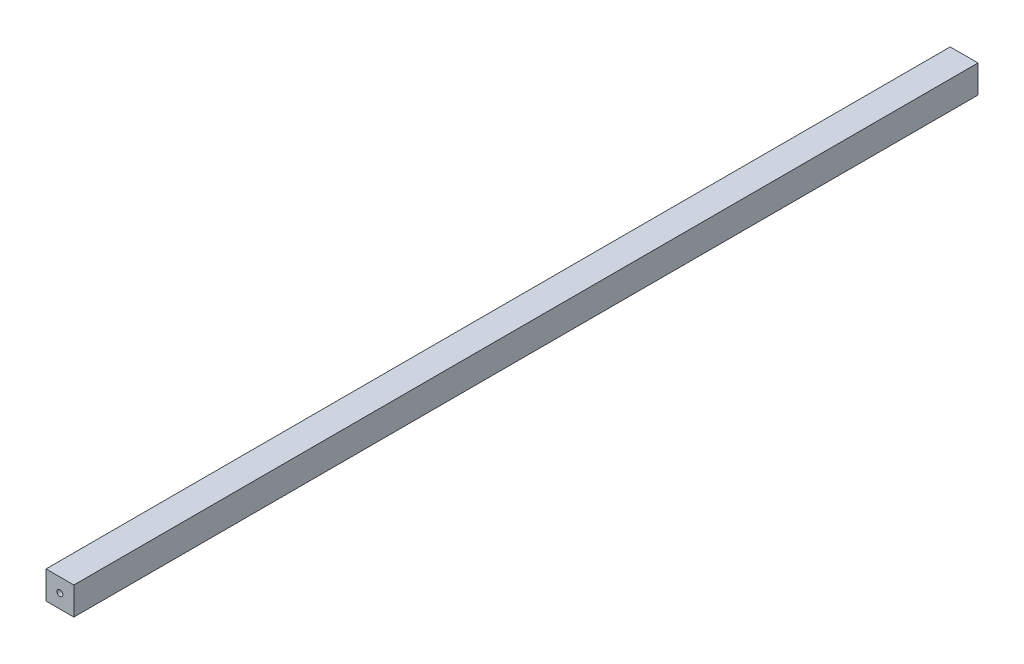
ISO-10303-21;
HEADER;
FILE_DESCRIPTION(('STEP AP214'),'2;1');
FILE_NAME('part.step','',(''),(''),'','','');
FILE_SCHEMA(('AUTOMOTIVE_DESIGN { 1 0 10303 214 1 1 1 1 }'));
ENDSEC;
DATA;
#1=APPLICATION_CONTEXT('core data for automotive mechanical design processes');
#2=APPLICATION_PROTOCOL_DEFINITION('international standard','automotive_design',2000,#1);
#3=PRODUCT_CONTEXT('',#1,'mechanical');
#4=PRODUCT('Part','Part','',(#3));
#5=PRODUCT_RELATED_PRODUCT_CATEGORY('part','',(#4));
#6=PRODUCT_DEFINITION_FORMATION('','',#4);
#7=PRODUCT_DEFINITION_CONTEXT('part definition',#1,'design');
#8=PRODUCT_DEFINITION('design','',#6,#7);
#9=PRODUCT_DEFINITION_SHAPE('','',#8);
#10=(LENGTH_UNIT() NAMED_UNIT(*) SI_UNIT(.MILLI.,.METRE.));
#11=(NAMED_UNIT(*) PLANE_ANGLE_UNIT() SI_UNIT($,.RADIAN.));
#12=(NAMED_UNIT(*) SI_UNIT($,.STERADIAN.) SOLID_ANGLE_UNIT());
#13=UNCERTAINTY_MEASURE_WITH_UNIT(LENGTH_MEASURE(1.E-05),#10,'distance_accuracy_value','');
#14=(GEOMETRIC_REPRESENTATION_CONTEXT(3) GLOBAL_UNCERTAINTY_ASSIGNED_CONTEXT((#13)) GLOBAL_UNIT_ASSIGNED_CONTEXT((#10,
#11,#12)) REPRESENTATION_CONTEXT('',''));
#15=CARTESIAN_POINT('',(0.,0.,0.));
#16=DIRECTION('',(0.,0.,1.));
#17=DIRECTION('',(1.,0.,0.));
#18=AXIS2_PLACEMENT_3D('',#15,#16,#17);
#19=CARTESIAN_POINT('',(0.,0.,-1.));
#20=DIRECTION('',(0.,0.,1.));
#21=DIRECTION('',(1.,0.,0.));
#22=AXIS2_PLACEMENT_3D('',#19,#20,#21);
#23=CYLINDRICAL_SURFACE('',#22,2.1);
#24=CARTESIAN_POINT('',(0.,0.,650.));
#25=DIRECTION('',(0.,0.,1.));
#26=DIRECTION('',(1.,0.,0.));
#27=AXIS2_PLACEMENT_3D('',#24,#25,#26);
#28=CIRCLE('',#27,2.1);
#29=CARTESIAN_POINT('',(2.1,0.,650.));
#30=VERTEX_POINT('',#29);
#31=EDGE_CURVE('E95',#30,#30,#28,.T.);
#32=ORIENTED_EDGE('',*,*,#31,.T.);
#33=EDGE_LOOP('',(#32));
#34=FACE_BOUND('',#33,.T.);
#35=CARTESIAN_POINT('',(0.,0.,0.));
#36=DIRECTION('',(0.,0.,1.));
#37=DIRECTION('',(1.,0.,0.));
#38=AXIS2_PLACEMENT_3D('',#35,#36,#37);
#39=CIRCLE('',#38,2.1);
#40=CARTESIAN_POINT('',(2.1,0.,0.));
#41=VERTEX_POINT('',#40);
#42=EDGE_CURVE('E10',#41,#41,#39,.T.);
#43=ORIENTED_EDGE('',*,*,#42,.F.);
#44=EDGE_LOOP('',(#43));
#45=FACE_BOUND('',#44,.T.);
#46=ADVANCED_FACE('F16',(#34,#45),#23,.F.);
#47=CARTESIAN_POINT('',(10.,-10.,0.));
#48=DIRECTION('',(1.,0.,0.));
#49=DIRECTION('',(0.,1.,0.));
#50=AXIS2_PLACEMENT_3D('',#47,#48,#49);
#51=PLANE('',#50);
#52=DIRECTION('',(0.,0.,1.));
#53=VECTOR('',#52,1.);
#54=CARTESIAN_POINT('',(10.,-10.,0.));
#55=LINE('',#54,#53);
#56=CARTESIAN_POINT('',(10.,-10.,0.));
#57=VERTEX_POINT('',#56);
#58=CARTESIAN_POINT('',(10.,-10.,650.));
#59=VERTEX_POINT('',#58);
#60=EDGE_CURVE('E71',#57,#59,#55,.T.);
#61=ORIENTED_EDGE('',*,*,#60,.F.);
#62=DIRECTION('',(0.,1.,0.));
#63=VECTOR('',#62,1.);
#64=CARTESIAN_POINT('',(10.,-10.,0.));
#65=LINE('',#64,#63);
#66=CARTESIAN_POINT('',(10.,10.,0.));
#67=VERTEX_POINT('',#66);
#68=EDGE_CURVE('E24',#57,#67,#65,.T.);
#69=ORIENTED_EDGE('',*,*,#68,.T.);
#70=DIRECTION('',(0.,0.,1.));
#71=VECTOR('',#70,1.);
#72=CARTESIAN_POINT('',(10.,10.,0.));
#73=LINE('',#72,#71);
#74=CARTESIAN_POINT('',(10.,10.,650.));
#75=VERTEX_POINT('',#74);
#76=EDGE_CURVE('E44',#67,#75,#73,.T.);
#77=ORIENTED_EDGE('',*,*,#76,.T.);
#78=DIRECTION('',(0.,1.,0.));
#79=VECTOR('',#78,1.);
#80=CARTESIAN_POINT('',(10.,-10.,650.));
#81=LINE('',#80,#79);
#82=EDGE_CURVE('E76',#59,#75,#81,.T.);
#83=ORIENTED_EDGE('',*,*,#82,.F.);
#84=EDGE_LOOP('',(#61,#69,#77,#83));
#85=FACE_BOUND('',#84,.T.);
#86=ADVANCED_FACE('F79',(#85),#51,.T.);
#87=CARTESIAN_POINT('',(-10.,-10.,0.));
#88=DIRECTION('',(0.,0.,1.));
#89=DIRECTION('',(1.,0.,0.));
#90=AXIS2_PLACEMENT_3D('',#87,#88,#89);
#91=PLANE('',#90);
#92=ORIENTED_EDGE('',*,*,#42,.T.);
#93=EDGE_LOOP('',(#92));
#94=FACE_BOUND('',#93,.T.);
#95=DIRECTION('',(1.,0.,0.));
#96=VECTOR('',#95,1.);
#97=CARTESIAN_POINT('',(-10.,10.,0.));
#98=LINE('',#97,#96);
#99=CARTESIAN_POINT('',(-10.,10.,0.));
#100=VERTEX_POINT('',#99);
#101=EDGE_CURVE('E64',#100,#67,#98,.T.);
#102=ORIENTED_EDGE('',*,*,#101,.T.);
#103=ORIENTED_EDGE('',*,*,#68,.F.);
#104=DIRECTION('',(1.,0.,0.));
#105=VECTOR('',#104,1.);
#106=CARTESIAN_POINT('',(-10.,-10.,0.));
#107=LINE('',#106,#105);
#108=CARTESIAN_POINT('',(-10.,-10.,0.));
#109=VERTEX_POINT('',#108);
#110=EDGE_CURVE('E61',#109,#57,#107,.T.);
#111=ORIENTED_EDGE('',*,*,#110,.F.);
#112=DIRECTION('',(0.,1.,0.));
#113=VECTOR('',#112,1.);
#114=CARTESIAN_POINT('',(-10.,-10.,0.));
#115=LINE('',#114,#113);
#116=EDGE_CURVE('E88',#109,#100,#115,.T.);
#117=ORIENTED_EDGE('',*,*,#116,.T.);
#118=EDGE_LOOP('',(#102,#103,#111,#117));
#119=FACE_BOUND('',#118,.T.);
#120=ADVANCED_FACE('F59',(#94,#119),#91,.F.);
#121=CARTESIAN_POINT('',(-10.,10.,0.));
#122=DIRECTION('',(0.,1.,0.));
#123=DIRECTION('',(1.,0.,0.));
#124=AXIS2_PLACEMENT_3D('',#121,#122,#123);
#125=PLANE('',#124);
#126=ORIENTED_EDGE('',*,*,#101,.F.);
#127=DIRECTION('',(0.,0.,1.));
#128=VECTOR('',#127,1.);
#129=CARTESIAN_POINT('',(-10.,10.,0.));
#130=LINE('',#129,#128);
#131=CARTESIAN_POINT('',(-10.,10.,650.));
#132=VERTEX_POINT('',#131);
#133=EDGE_CURVE('E173',#100,#132,#130,.T.);
#134=ORIENTED_EDGE('',*,*,#133,.T.);
#135=DIRECTION('',(1.,0.,0.));
#136=VECTOR('',#135,1.);
#137=CARTESIAN_POINT('',(-10.,10.,650.));
#138=LINE('',#137,#136);
#139=EDGE_CURVE('E92',#132,#75,#138,.T.);
#140=ORIENTED_EDGE('',*,*,#139,.T.);
#141=ORIENTED_EDGE('',*,*,#76,.F.);
#142=EDGE_LOOP('',(#126,#134,#140,#141));
#143=FACE_BOUND('',#142,.T.);
#144=ADVANCED_FACE('F129',(#143),#125,.T.);
#145=CARTESIAN_POINT('',(-10.,-10.,650.));
#146=DIRECTION('',(0.,0.,1.));
#147=DIRECTION('',(1.,0.,0.));
#148=AXIS2_PLACEMENT_3D('',#145,#146,#147);
#149=PLANE('',#148);
#150=ORIENTED_EDGE('',*,*,#31,.F.);
#151=EDGE_LOOP('',(#150));
#152=FACE_BOUND('',#151,.T.);
#153=DIRECTION('',(0.,1.,0.));
#154=VECTOR('',#153,1.);
#155=CARTESIAN_POINT('',(-10.,-10.,650.));
#156=LINE('',#155,#154);
#157=CARTESIAN_POINT('',(-10.,-10.,650.));
#158=VERTEX_POINT('',#157);
#159=EDGE_CURVE('E178',#158,#132,#156,.T.);
#160=ORIENTED_EDGE('',*,*,#159,.F.);
#161=DIRECTION('',(1.,0.,0.));
#162=VECTOR('',#161,1.);
#163=CARTESIAN_POINT('',(-10.,-10.,650.));
#164=LINE('',#163,#162);
#165=EDGE_CURVE('E77',#158,#59,#164,.T.);
#166=ORIENTED_EDGE('',*,*,#165,.T.);
#167=ORIENTED_EDGE('',*,*,#82,.T.);
#168=ORIENTED_EDGE('',*,*,#139,.F.);
#169=EDGE_LOOP('',(#160,#166,#167,#168));
#170=FACE_BOUND('',#169,.T.);
#171=ADVANCED_FACE('F121',(#152,#170),#149,.T.);
#172=CARTESIAN_POINT('',(-10.,-10.,0.));
#173=DIRECTION('',(0.,1.,0.));
#174=DIRECTION('',(1.,0.,0.));
#175=AXIS2_PLACEMENT_3D('',#172,#173,#174);
#176=PLANE('',#175);
#177=ORIENTED_EDGE('',*,*,#60,.T.);
#178=ORIENTED_EDGE('',*,*,#165,.F.);
#179=DIRECTION('',(0.,0.,1.));
#180=VECTOR('',#179,1.);
#181=CARTESIAN_POINT('',(-10.,-10.,0.));
#182=LINE('',#181,#180);
#183=EDGE_CURVE('E73',#109,#158,#182,.T.);
#184=ORIENTED_EDGE('',*,*,#183,.F.);
#185=ORIENTED_EDGE('',*,*,#110,.T.);
#186=EDGE_LOOP('',(#177,#178,#184,#185));
#187=FACE_BOUND('',#186,.T.);
#188=ADVANCED_FACE('F69',(#187),#176,.F.);
#189=CARTESIAN_POINT('',(-10.,-10.,0.));
#190=DIRECTION('',(1.,0.,0.));
#191=DIRECTION('',(0.,1.,0.));
#192=AXIS2_PLACEMENT_3D('',#189,#190,#191);
#193=PLANE('',#192);
#194=ORIENTED_EDGE('',*,*,#159,.T.);
#195=ORIENTED_EDGE('',*,*,#133,.F.);
#196=ORIENTED_EDGE('',*,*,#116,.F.);
#197=ORIENTED_EDGE('',*,*,#183,.T.);
#198=EDGE_LOOP('',(#194,#195,#196,#197));
#199=FACE_BOUND('',#198,.T.);
#200=ADVANCED_FACE('F107',(#199),#193,.F.);
#201=CLOSED_SHELL('',(#46,#86,#120,#144,#171,#188,#200));
#202=MANIFOLD_SOLID_BREP('B1',#201);
#203=ADVANCED_BREP_SHAPE_REPRESENTATION('',(#18,#202),#14);
#204=SHAPE_DEFINITION_REPRESENTATION(#9,#203);
ENDSEC;
END-ISO-10303-21;
